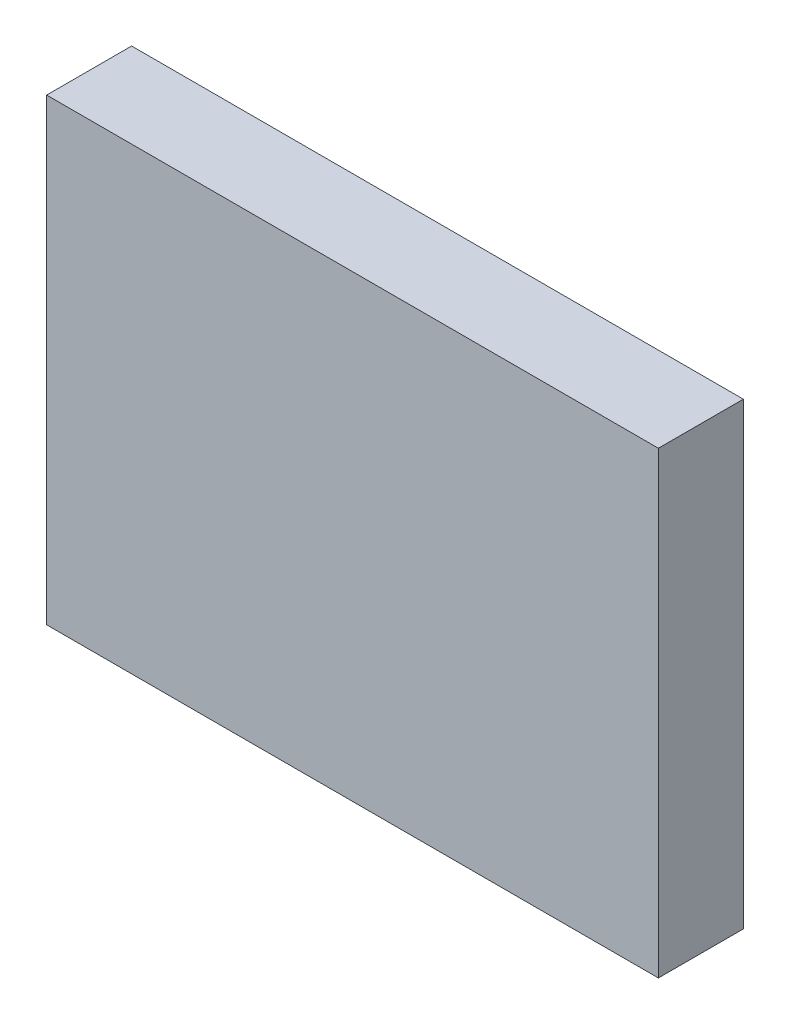
ISO-10303-21;
HEADER;
FILE_DESCRIPTION(('STEP AP214'),'2;1');
FILE_NAME('part.step','',(''),(''),'','','');
FILE_SCHEMA(('AUTOMOTIVE_DESIGN { 1 0 10303 214 1 1 1 1 }'));
ENDSEC;
DATA;
#1=APPLICATION_CONTEXT('core data for automotive mechanical design processes');
#2=APPLICATION_PROTOCOL_DEFINITION('international standard','automotive_design',2000,#1);
#3=PRODUCT_CONTEXT('',#1,'mechanical');
#4=PRODUCT('Part','Part','',(#3));
#5=PRODUCT_RELATED_PRODUCT_CATEGORY('part','',(#4));
#6=PRODUCT_DEFINITION_FORMATION('','',#4);
#7=PRODUCT_DEFINITION_CONTEXT('part definition',#1,'design');
#8=PRODUCT_DEFINITION('design','',#6,#7);
#9=PRODUCT_DEFINITION_SHAPE('','',#8);
#10=(LENGTH_UNIT() NAMED_UNIT(*) SI_UNIT(.MILLI.,.METRE.));
#11=(NAMED_UNIT(*) PLANE_ANGLE_UNIT() SI_UNIT($,.RADIAN.));
#12=(NAMED_UNIT(*) SI_UNIT($,.STERADIAN.) SOLID_ANGLE_UNIT());
#13=UNCERTAINTY_MEASURE_WITH_UNIT(LENGTH_MEASURE(1.E-05),#10,'distance_accuracy_value','');
#14=(GEOMETRIC_REPRESENTATION_CONTEXT(3) GLOBAL_UNCERTAINTY_ASSIGNED_CONTEXT((#13)) GLOBAL_UNIT_ASSIGNED_CONTEXT((#10,
#11,#12)) REPRESENTATION_CONTEXT('',''));
#15=CARTESIAN_POINT('',(0.,0.,0.));
#16=DIRECTION('',(0.,0.,1.));
#17=DIRECTION('',(1.,0.,0.));
#18=AXIS2_PLACEMENT_3D('',#15,#16,#17);
#19=CARTESIAN_POINT('',(-0.8999982,0.67499992,0.));
#20=DIRECTION('',(0.,0.,-1.));
#21=DIRECTION('',(-1.,0.,0.));
#22=AXIS2_PLACEMENT_3D('',#19,#20,#21);
#23=PLANE('',#22);
#24=DIRECTION('',(1.,0.,0.));
#25=VECTOR('',#24,1.);
#26=CARTESIAN_POINT('',(0.90000074,0.67499992,0.));
#27=LINE('',#26,#25);
#28=CARTESIAN_POINT('',(-0.8999982,0.67499992,0.));
#29=VERTEX_POINT('',#28);
#30=CARTESIAN_POINT('',(0.90000074,0.67499992,0.));
#31=VERTEX_POINT('',#30);
#32=EDGE_CURVE('E58',#29,#31,#27,.T.);
#33=ORIENTED_EDGE('',*,*,#32,.T.);
#34=DIRECTION('',(0.,1.,0.));
#35=VECTOR('',#34,1.);
#36=CARTESIAN_POINT('',(0.90000074,-0.67499992,0.));
#37=LINE('',#36,#35);
#38=CARTESIAN_POINT('',(0.90000074,-0.67499992,0.));
#39=VERTEX_POINT('',#38);
#40=EDGE_CURVE('E53',#31,#39,#37,.F.);
#41=ORIENTED_EDGE('',*,*,#40,.T.);
#42=DIRECTION('',(1.,0.,0.));
#43=VECTOR('',#42,1.);
#44=CARTESIAN_POINT('',(-0.8999982,-0.67499992,0.));
#45=LINE('',#44,#43);
#46=CARTESIAN_POINT('',(-0.8999982,-0.67499992,0.));
#47=VERTEX_POINT('',#46);
#48=EDGE_CURVE('E68',#39,#47,#45,.F.);
#49=ORIENTED_EDGE('',*,*,#48,.T.);
#50=DIRECTION('',(0.,1.,0.));
#51=VECTOR('',#50,1.);
#52=CARTESIAN_POINT('',(-0.8999982,0.67499992,0.));
#53=LINE('',#52,#51);
#54=EDGE_CURVE('E20',#47,#29,#53,.T.);
#55=ORIENTED_EDGE('',*,*,#54,.T.);
#56=EDGE_LOOP('',(#33,#41,#49,#55));
#57=FACE_BOUND('',#56,.T.);
#58=ADVANCED_FACE('F17',(#57),#23,.T.);
#59=CARTESIAN_POINT('',(-0.8999982,0.67499992,0.));
#60=DIRECTION('',(1.,0.,0.));
#61=DIRECTION('',(0.,0.,-1.));
#62=AXIS2_PLACEMENT_3D('',#59,#60,#61);
#63=PLANE('',#62);
#64=DIRECTION('',(0.,1.,0.));
#65=VECTOR('',#64,1.);
#66=CARTESIAN_POINT('',(-0.8999982,0.67499992,0.25));
#67=LINE('',#66,#65);
#68=CARTESIAN_POINT('',(-0.8999982,-0.67499992,0.25));
#69=VERTEX_POINT('',#68);
#70=CARTESIAN_POINT('',(-0.8999982,0.67499992,0.25));
#71=VERTEX_POINT('',#70);
#72=EDGE_CURVE('E74',#69,#71,#67,.T.);
#73=ORIENTED_EDGE('',*,*,#72,.T.);
#74=DIRECTION('',(0.,0.,-1.));
#75=VECTOR('',#74,1.);
#76=CARTESIAN_POINT('',(-0.8999982,0.67499992,0.));
#77=LINE('',#76,#75);
#78=EDGE_CURVE('E63',#71,#29,#77,.T.);
#79=ORIENTED_EDGE('',*,*,#78,.T.);
#80=ORIENTED_EDGE('',*,*,#54,.F.);
#81=DIRECTION('',(0.,0.,1.));
#82=VECTOR('',#81,1.);
#83=CARTESIAN_POINT('',(-0.8999982,-0.67499992,0.));
#84=LINE('',#83,#82);
#85=EDGE_CURVE('E80',#47,#69,#84,.T.);
#86=ORIENTED_EDGE('',*,*,#85,.T.);
#87=EDGE_LOOP('',(#73,#79,#80,#86));
#88=FACE_BOUND('',#87,.T.);
#89=ADVANCED_FACE('F73',(#88),#63,.F.);
#90=CARTESIAN_POINT('',(0.90000074,0.67499992,0.));
#91=DIRECTION('',(0.,-1.,0.));
#92=DIRECTION('',(0.,0.,-1.));
#93=AXIS2_PLACEMENT_3D('',#90,#91,#92);
#94=PLANE('',#93);
#95=DIRECTION('',(-1.,0.,0.));
#96=VECTOR('',#95,1.);
#97=CARTESIAN_POINT('',(-0.8999982,0.67499992,0.25));
#98=LINE('',#97,#96);
#99=CARTESIAN_POINT('',(0.90000074,0.67499992,0.25));
#100=VERTEX_POINT('',#99);
#101=EDGE_CURVE('E84',#71,#100,#98,.F.);
#102=ORIENTED_EDGE('',*,*,#101,.T.);
#103=DIRECTION('',(0.,0.,1.));
#104=VECTOR('',#103,1.);
#105=CARTESIAN_POINT('',(0.90000074,0.67499992,0.));
#106=LINE('',#105,#104);
#107=EDGE_CURVE('E65',#100,#31,#106,.F.);
#108=ORIENTED_EDGE('',*,*,#107,.T.);
#109=ORIENTED_EDGE('',*,*,#32,.F.);
#110=ORIENTED_EDGE('',*,*,#78,.F.);
#111=EDGE_LOOP('',(#102,#108,#109,#110));
#112=FACE_BOUND('',#111,.T.);
#113=ADVANCED_FACE('F61',(#112),#94,.F.);
#114=CARTESIAN_POINT('',(0.90000074,-0.67499992,0.));
#115=DIRECTION('',(-1.,0.,0.));
#116=DIRECTION('',(0.,0.,1.));
#117=AXIS2_PLACEMENT_3D('',#114,#115,#116);
#118=PLANE('',#117);
#119=DIRECTION('',(0.,1.,0.));
#120=VECTOR('',#119,1.);
#121=CARTESIAN_POINT('',(0.90000074,0.67499992,0.25));
#122=LINE('',#121,#120);
#123=CARTESIAN_POINT('',(0.90000074,-0.67499992,0.25));
#124=VERTEX_POINT('',#123);
#125=EDGE_CURVE('E26',#100,#124,#122,.F.);
#126=ORIENTED_EDGE('',*,*,#125,.T.);
#127=DIRECTION('',(0.,0.,1.));
#128=VECTOR('',#127,1.);
#129=CARTESIAN_POINT('',(0.90000074,-0.67499992,0.));
#130=LINE('',#129,#128);
#131=EDGE_CURVE('E34',#124,#39,#130,.F.);
#132=ORIENTED_EDGE('',*,*,#131,.T.);
#133=ORIENTED_EDGE('',*,*,#40,.F.);
#134=ORIENTED_EDGE('',*,*,#107,.F.);
#135=EDGE_LOOP('',(#126,#132,#133,#134));
#136=FACE_BOUND('',#135,.T.);
#137=ADVANCED_FACE('F88',(#136),#118,.F.);
#138=CARTESIAN_POINT('',(-0.8999982,-0.67499992,0.));
#139=DIRECTION('',(0.,1.,0.));
#140=DIRECTION('',(0.,0.,1.));
#141=AXIS2_PLACEMENT_3D('',#138,#139,#140);
#142=PLANE('',#141);
#143=DIRECTION('',(-1.,0.,0.));
#144=VECTOR('',#143,1.);
#145=CARTESIAN_POINT('',(-0.8999982,-0.67499992,0.25));
#146=LINE('',#145,#144);
#147=EDGE_CURVE('E11',#124,#69,#146,.T.);
#148=ORIENTED_EDGE('',*,*,#147,.T.);
#149=ORIENTED_EDGE('',*,*,#85,.F.);
#150=ORIENTED_EDGE('',*,*,#48,.F.);
#151=ORIENTED_EDGE('',*,*,#131,.F.);
#152=EDGE_LOOP('',(#148,#149,#150,#151));
#153=FACE_BOUND('',#152,.T.);
#154=ADVANCED_FACE('F91',(#153),#142,.F.);
#155=CARTESIAN_POINT('',(-0.8999982,0.67499992,0.25));
#156=DIRECTION('',(0.,0.,-1.));
#157=DIRECTION('',(-1.,0.,0.));
#158=AXIS2_PLACEMENT_3D('',#155,#156,#157);
#159=PLANE('',#158);
#160=ORIENTED_EDGE('',*,*,#125,.F.);
#161=ORIENTED_EDGE('',*,*,#101,.F.);
#162=ORIENTED_EDGE('',*,*,#72,.F.);
#163=ORIENTED_EDGE('',*,*,#147,.F.);
#164=EDGE_LOOP('',(#160,#161,#162,#163));
#165=FACE_BOUND('',#164,.T.);
#166=ADVANCED_FACE('F90',(#165),#159,.F.);
#167=CLOSED_SHELL('',(#58,#89,#113,#137,#154,#166));
#168=MANIFOLD_SOLID_BREP('B1',#167);
#169=ADVANCED_BREP_SHAPE_REPRESENTATION('',(#18,#168),#14);
#170=SHAPE_DEFINITION_REPRESENTATION(#9,#169);
ENDSEC;
END-ISO-10303-21;
